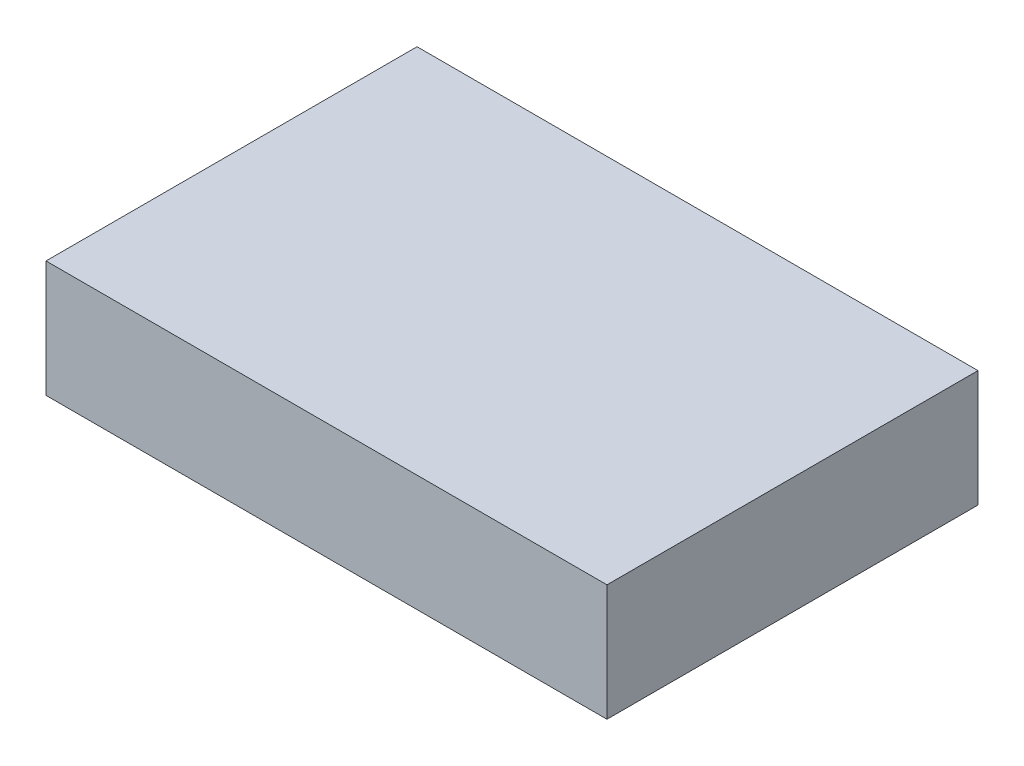
ISO-10303-21;
HEADER;
FILE_DESCRIPTION(('STEP AP214'),'2;1');
FILE_NAME('part.step','',(''),(''),'','','');
FILE_SCHEMA(('AUTOMOTIVE_DESIGN { 1 0 10303 214 1 1 1 1 }'));
ENDSEC;
DATA;
#1=APPLICATION_CONTEXT('core data for automotive mechanical design processes');
#2=APPLICATION_PROTOCOL_DEFINITION('international standard','automotive_design',2000,#1);
#3=PRODUCT_CONTEXT('',#1,'mechanical');
#4=PRODUCT('Part','Part','',(#3));
#5=PRODUCT_RELATED_PRODUCT_CATEGORY('part','',(#4));
#6=PRODUCT_DEFINITION_FORMATION('','',#4);
#7=PRODUCT_DEFINITION_CONTEXT('part definition',#1,'design');
#8=PRODUCT_DEFINITION('design','',#6,#7);
#9=PRODUCT_DEFINITION_SHAPE('','',#8);
#10=(LENGTH_UNIT() NAMED_UNIT(*) SI_UNIT(.MILLI.,.METRE.));
#11=(NAMED_UNIT(*) PLANE_ANGLE_UNIT() SI_UNIT($,.RADIAN.));
#12=(NAMED_UNIT(*) SI_UNIT($,.STERADIAN.) SOLID_ANGLE_UNIT());
#13=UNCERTAINTY_MEASURE_WITH_UNIT(LENGTH_MEASURE(1.E-05),#10,'distance_accuracy_value','');
#14=(GEOMETRIC_REPRESENTATION_CONTEXT(3) GLOBAL_UNCERTAINTY_ASSIGNED_CONTEXT((#13)) GLOBAL_UNIT_ASSIGNED_CONTEXT((#10,
#11,#12)) REPRESENTATION_CONTEXT('',''));
#15=CARTESIAN_POINT('',(0.,0.,0.));
#16=DIRECTION('',(0.,0.,1.));
#17=DIRECTION('',(1.,0.,0.));
#18=AXIS2_PLACEMENT_3D('',#15,#16,#17);
#19=CARTESIAN_POINT('',(0.,-25.4,0.));
#20=DIRECTION('',(-1.,0.,0.));
#21=DIRECTION('',(0.,0.,1.));
#22=AXIS2_PLACEMENT_3D('',#19,#20,#21);
#23=PLANE('',#22);
#24=DIRECTION('',(0.,0.,1.));
#25=VECTOR('',#24,1.);
#26=CARTESIAN_POINT('',(0.,0.,0.));
#27=LINE('',#26,#25);
#28=CARTESIAN_POINT('',(0.,0.,-80.9292583117359));
#29=VERTEX_POINT('',#28);
#30=CARTESIAN_POINT('',(0.,0.,0.));
#31=VERTEX_POINT('',#30);
#32=EDGE_CURVE('E95',#29,#31,#27,.T.);
#33=ORIENTED_EDGE('',*,*,#32,.F.);
#34=DIRECTION('',(0.,1.,0.));
#35=VECTOR('',#34,1.);
#36=CARTESIAN_POINT('',(0.,-25.4,-80.9292583117359));
#37=LINE('',#36,#35);
#38=CARTESIAN_POINT('',(0.,-25.4,-80.9292583117359));
#39=VERTEX_POINT('',#38);
#40=EDGE_CURVE('E11',#39,#29,#37,.T.);
#41=ORIENTED_EDGE('',*,*,#40,.F.);
#42=DIRECTION('',(0.,0.,1.));
#43=VECTOR('',#42,1.);
#44=CARTESIAN_POINT('',(0.,-25.4,0.));
#45=LINE('',#44,#43);
#46=CARTESIAN_POINT('',(0.,-25.4,0.));
#47=VERTEX_POINT('',#46);
#48=EDGE_CURVE('E89',#39,#47,#45,.T.);
#49=ORIENTED_EDGE('',*,*,#48,.T.);
#50=DIRECTION('',(0.,1.,0.));
#51=VECTOR('',#50,1.);
#52=CARTESIAN_POINT('',(0.,-25.4,0.));
#53=LINE('',#52,#51);
#54=EDGE_CURVE('E34',#47,#31,#53,.T.);
#55=ORIENTED_EDGE('',*,*,#54,.T.);
#56=EDGE_LOOP('',(#33,#41,#49,#55));
#57=FACE_BOUND('',#56,.T.);
#58=ADVANCED_FACE('F31',(#57),#23,.T.);
#59=CARTESIAN_POINT('',(0.,-25.4,-80.9292583117359));
#60=DIRECTION('',(0.,0.,-1.));
#61=DIRECTION('',(-1.,0.,0.));
#62=AXIS2_PLACEMENT_3D('',#59,#60,#61);
#63=PLANE('',#62);
#64=DIRECTION('',(-1.,0.,0.));
#65=VECTOR('',#64,1.);
#66=CARTESIAN_POINT('',(0.,0.,-80.9292583117359));
#67=LINE('',#66,#65);
#68=CARTESIAN_POINT('',(122.35392100101,0.,-80.9292583117359));
#69=VERTEX_POINT('',#68);
#70=EDGE_CURVE('E91',#69,#29,#67,.T.);
#71=ORIENTED_EDGE('',*,*,#70,.F.);
#72=DIRECTION('',(0.,1.,0.));
#73=VECTOR('',#72,1.);
#74=CARTESIAN_POINT('',(122.35392100101,-25.4,-80.9292583117359));
#75=LINE('',#74,#73);
#76=CARTESIAN_POINT('',(122.35392100101,-25.4,-80.9292583117359));
#77=VERTEX_POINT('',#76);
#78=EDGE_CURVE('E40',#77,#69,#75,.T.);
#79=ORIENTED_EDGE('',*,*,#78,.F.);
#80=DIRECTION('',(-1.,0.,0.));
#81=VECTOR('',#80,1.);
#82=CARTESIAN_POINT('',(0.,-25.4,-80.9292583117359));
#83=LINE('',#82,#81);
#84=EDGE_CURVE('E86',#77,#39,#83,.T.);
#85=ORIENTED_EDGE('',*,*,#84,.T.);
#86=ORIENTED_EDGE('',*,*,#40,.T.);
#87=EDGE_LOOP('',(#71,#79,#85,#86));
#88=FACE_BOUND('',#87,.T.);
#89=ADVANCED_FACE('F105',(#88),#63,.T.);
#90=CARTESIAN_POINT('',(122.35392100101,-25.4,0.));
#91=DIRECTION('',(1.,0.,0.));
#92=DIRECTION('',(0.,0.,-1.));
#93=AXIS2_PLACEMENT_3D('',#90,#91,#92);
#94=PLANE('',#93);
#95=DIRECTION('',(0.,0.,-1.));
#96=VECTOR('',#95,1.);
#97=CARTESIAN_POINT('',(122.35392100101,0.,0.));
#98=LINE('',#97,#96);
#99=CARTESIAN_POINT('',(122.35392100101,0.,0.));
#100=VERTEX_POINT('',#99);
#101=EDGE_CURVE('E81',#100,#69,#98,.T.);
#102=ORIENTED_EDGE('',*,*,#101,.F.);
#103=DIRECTION('',(0.,1.,0.));
#104=VECTOR('',#103,1.);
#105=CARTESIAN_POINT('',(122.35392100101,-25.4,0.));
#106=LINE('',#105,#104);
#107=CARTESIAN_POINT('',(122.35392100101,-25.4,0.));
#108=VERTEX_POINT('',#107);
#109=EDGE_CURVE('E76',#108,#100,#106,.T.);
#110=ORIENTED_EDGE('',*,*,#109,.F.);
#111=DIRECTION('',(0.,0.,-1.));
#112=VECTOR('',#111,1.);
#113=CARTESIAN_POINT('',(122.35392100101,-25.4,0.));
#114=LINE('',#113,#112);
#115=EDGE_CURVE('E79',#108,#77,#114,.T.);
#116=ORIENTED_EDGE('',*,*,#115,.T.);
#117=ORIENTED_EDGE('',*,*,#78,.T.);
#118=EDGE_LOOP('',(#102,#110,#116,#117));
#119=FACE_BOUND('',#118,.T.);
#120=ADVANCED_FACE('F78',(#119),#94,.T.);
#121=CARTESIAN_POINT('',(0.,-25.4,0.));
#122=DIRECTION('',(0.,0.,1.));
#123=DIRECTION('',(1.,0.,0.));
#124=AXIS2_PLACEMENT_3D('',#121,#122,#123);
#125=PLANE('',#124);
#126=DIRECTION('',(1.,0.,0.));
#127=VECTOR('',#126,1.);
#128=CARTESIAN_POINT('',(0.,0.,0.));
#129=LINE('',#128,#127);
#130=EDGE_CURVE('E98',#31,#100,#129,.T.);
#131=ORIENTED_EDGE('',*,*,#130,.F.);
#132=ORIENTED_EDGE('',*,*,#54,.F.);
#133=DIRECTION('',(1.,0.,0.));
#134=VECTOR('',#133,1.);
#135=CARTESIAN_POINT('',(0.,-25.4,0.));
#136=LINE('',#135,#134);
#137=EDGE_CURVE('E85',#47,#108,#136,.T.);
#138=ORIENTED_EDGE('',*,*,#137,.T.);
#139=ORIENTED_EDGE('',*,*,#109,.T.);
#140=EDGE_LOOP('',(#131,#132,#138,#139));
#141=FACE_BOUND('',#140,.T.);
#142=ADVANCED_FACE('F88',(#141),#125,.T.);
#143=CARTESIAN_POINT('',(0.,-25.4,-80.9292583117359));
#144=DIRECTION('',(0.,-1.,0.));
#145=DIRECTION('',(0.,0.,-1.));
#146=AXIS2_PLACEMENT_3D('',#143,#144,#145);
#147=PLANE('',#146);
#148=ORIENTED_EDGE('',*,*,#48,.F.);
#149=ORIENTED_EDGE('',*,*,#84,.F.);
#150=ORIENTED_EDGE('',*,*,#115,.F.);
#151=ORIENTED_EDGE('',*,*,#137,.F.);
#152=EDGE_LOOP('',(#148,#149,#150,#151));
#153=FACE_BOUND('',#152,.T.);
#154=ADVANCED_FACE('F84',(#153),#147,.T.);
#155=CARTESIAN_POINT('',(0.,0.,-80.9292583117359));
#156=DIRECTION('',(0.,-1.,0.));
#157=DIRECTION('',(0.,0.,-1.));
#158=AXIS2_PLACEMENT_3D('',#155,#156,#157);
#159=PLANE('',#158);
#160=ORIENTED_EDGE('',*,*,#32,.T.);
#161=ORIENTED_EDGE('',*,*,#130,.T.);
#162=ORIENTED_EDGE('',*,*,#101,.T.);
#163=ORIENTED_EDGE('',*,*,#70,.T.);
#164=EDGE_LOOP('',(#160,#161,#162,#163));
#165=FACE_BOUND('',#164,.T.);
#166=ADVANCED_FACE('F104',(#165),#159,.F.);
#167=CLOSED_SHELL('',(#58,#89,#120,#142,#154,#166));
#168=MANIFOLD_SOLID_BREP('B2',#167);
#169=ADVANCED_BREP_SHAPE_REPRESENTATION('',(#18,#168),#14);
#170=SHAPE_DEFINITION_REPRESENTATION(#9,#169);
ENDSEC;
END-ISO-10303-21;
